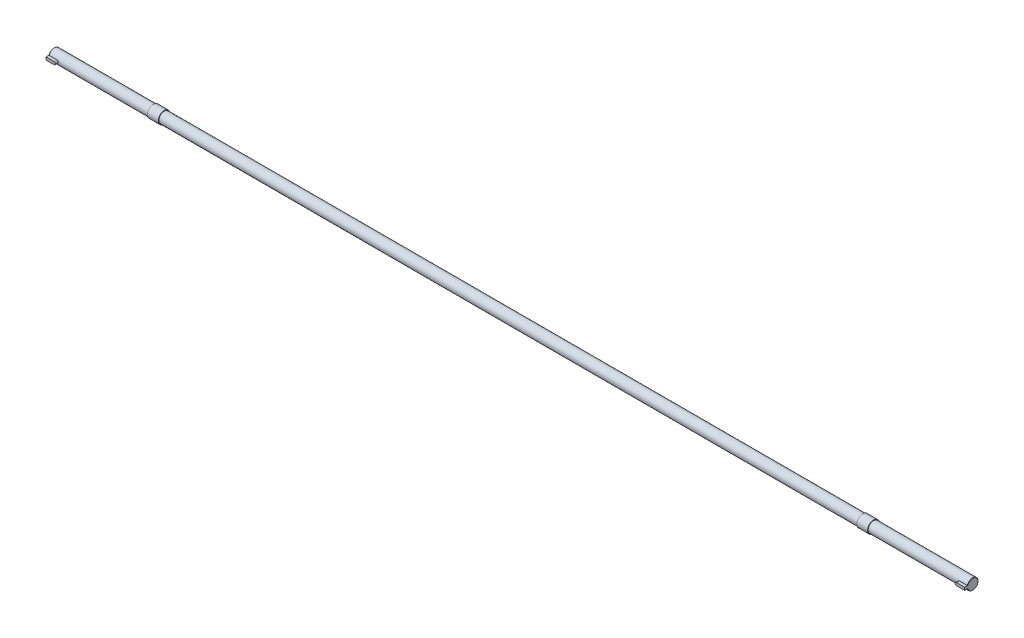
ISO-10303-21;
HEADER;
FILE_DESCRIPTION(('STEP AP214'),'2;1');
FILE_NAME('part.step','',(''),(''),'','','');
FILE_SCHEMA(('AUTOMOTIVE_DESIGN { 1 0 10303 214 1 1 1 1 }'));
ENDSEC;
DATA;
#1=APPLICATION_CONTEXT('core data for automotive mechanical design processes');
#2=APPLICATION_PROTOCOL_DEFINITION('international standard','automotive_design',2000,#1);
#3=PRODUCT_CONTEXT('',#1,'mechanical');
#4=PRODUCT('Part','Part','',(#3));
#5=PRODUCT_RELATED_PRODUCT_CATEGORY('part','',(#4));
#6=PRODUCT_DEFINITION_FORMATION('','',#4);
#7=PRODUCT_DEFINITION_CONTEXT('part definition',#1,'design');
#8=PRODUCT_DEFINITION('design','',#6,#7);
#9=PRODUCT_DEFINITION_SHAPE('','',#8);
#10=(LENGTH_UNIT() NAMED_UNIT(*) SI_UNIT(.MILLI.,.METRE.));
#11=(NAMED_UNIT(*) PLANE_ANGLE_UNIT() SI_UNIT($,.RADIAN.));
#12=(NAMED_UNIT(*) SI_UNIT($,.STERADIAN.) SOLID_ANGLE_UNIT());
#13=UNCERTAINTY_MEASURE_WITH_UNIT(LENGTH_MEASURE(1.E-05),#10,'distance_accuracy_value','');
#14=(GEOMETRIC_REPRESENTATION_CONTEXT(3) GLOBAL_UNCERTAINTY_ASSIGNED_CONTEXT((#13)) GLOBAL_UNIT_ASSIGNED_CONTEXT((#10,
#11,#12)) REPRESENTATION_CONTEXT('',''));
#15=CARTESIAN_POINT('',(0.,0.,0.));
#16=DIRECTION('',(0.,0.,1.));
#17=DIRECTION('',(1.,0.,0.));
#18=AXIS2_PLACEMENT_3D('',#15,#16,#17);
#19=CARTESIAN_POINT('',(-1695.,-20.0000000000002,0.));
#20=DIRECTION('',(-1.,0.,0.));
#21=DIRECTION('',(0.,-1.,0.));
#22=AXIS2_PLACEMENT_3D('',#19,#20,#21);
#23=PLANE('',#22);
#24=CARTESIAN_POINT('',(-1695.,0.,0.));
#25=DIRECTION('',(-1.,0.,0.));
#26=DIRECTION('',(0.,-1.,0.));
#27=AXIS2_PLACEMENT_3D('',#24,#25,#26);
#28=CIRCLE('',#27,19.000000000001);
#29=CARTESIAN_POINT('',(-1695.,5.00000000000015,18.3303027798244));
#30=VERTEX_POINT('',#29);
#31=CARTESIAN_POINT('',(-1695.,-4.99999999999985,18.3303027798245));
#32=VERTEX_POINT('',#31);
#33=EDGE_CURVE('E205',#30,#32,#28,.T.);
#34=ORIENTED_EDGE('',*,*,#33,.T.);
#35=DIRECTION('',(0.,0.,1.));
#36=VECTOR('',#35,1.);
#37=CARTESIAN_POINT('',(-1695.,-4.99999999999985,15.));
#38=LINE('',#37,#36);
#39=CARTESIAN_POINT('',(-1695.,-4.99999999999985,30.));
#40=VERTEX_POINT('',#39);
#41=EDGE_CURVE('E149',#32,#40,#38,.T.);
#42=ORIENTED_EDGE('',*,*,#41,.T.);
#43=DIRECTION('',(0.,-1.,0.));
#44=VECTOR('',#43,1.);
#45=CARTESIAN_POINT('',(-1695.,5.00000000000015,30.));
#46=LINE('',#45,#44);
#47=CARTESIAN_POINT('',(-1695.,5.00000000000015,30.));
#48=VERTEX_POINT('',#47);
#49=EDGE_CURVE('E138',#48,#40,#46,.T.);
#50=ORIENTED_EDGE('',*,*,#49,.F.);
#51=DIRECTION('',(0.,0.,1.));
#52=VECTOR('',#51,1.);
#53=CARTESIAN_POINT('',(-1695.,5.00000000000015,15.));
#54=LINE('',#53,#52);
#55=EDGE_CURVE('E127',#30,#48,#54,.T.);
#56=ORIENTED_EDGE('',*,*,#55,.F.);
#57=EDGE_LOOP('',(#34,#42,#50,#56));
#58=FACE_BOUND('',#57,.T.);
#59=ADVANCED_FACE('F39',(#58),#23,.T.);
#60=CARTESIAN_POINT('',(1695.,0.,0.));
#61=DIRECTION('',(1.,0.,0.));
#62=DIRECTION('',(0.,1.,0.));
#63=AXIS2_PLACEMENT_3D('',#60,#61,#62);
#64=PLANE('',#63);
#65=CARTESIAN_POINT('',(1695.,0.,0.));
#66=DIRECTION('',(1.,0.,0.));
#67=DIRECTION('',(0.,1.,0.));
#68=AXIS2_PLACEMENT_3D('',#65,#66,#67);
#69=CIRCLE('',#68,18.9999999999988);
#70=CARTESIAN_POINT('',(1695.,-5.00000000000007,18.3303027798221));
#71=VERTEX_POINT('',#70);
#72=CARTESIAN_POINT('',(1695.,4.99999999999993,18.3303027798221));
#73=VERTEX_POINT('',#72);
#74=EDGE_CURVE('E213',#71,#73,#69,.T.);
#75=ORIENTED_EDGE('',*,*,#74,.T.);
#76=DIRECTION('',(0.,0.,1.));
#77=VECTOR('',#76,1.);
#78=CARTESIAN_POINT('',(1695.,4.99999999999993,15.));
#79=LINE('',#78,#77);
#80=CARTESIAN_POINT('',(1695.,4.99999999999993,30.));
#81=VERTEX_POINT('',#80);
#82=EDGE_CURVE('E171',#73,#81,#79,.T.);
#83=ORIENTED_EDGE('',*,*,#82,.T.);
#84=DIRECTION('',(0.,1.,0.));
#85=VECTOR('',#84,1.);
#86=CARTESIAN_POINT('',(1695.,4.99999999999993,30.));
#87=LINE('',#86,#85);
#88=CARTESIAN_POINT('',(1695.,-5.00000000000007,30.));
#89=VERTEX_POINT('',#88);
#90=EDGE_CURVE('E161',#89,#81,#87,.T.);
#91=ORIENTED_EDGE('',*,*,#90,.F.);
#92=DIRECTION('',(0.,0.,1.));
#93=VECTOR('',#92,1.);
#94=CARTESIAN_POINT('',(1695.,-5.00000000000007,15.));
#95=LINE('',#94,#93);
#96=EDGE_CURVE('E173',#71,#89,#95,.T.);
#97=ORIENTED_EDGE('',*,*,#96,.F.);
#98=EDGE_LOOP('',(#75,#83,#91,#97));
#99=FACE_BOUND('',#98,.T.);
#100=ADVANCED_FACE('F266',(#99),#64,.T.);
#101=CARTESIAN_POINT('',(-1695.,0.,0.));
#102=DIRECTION('',(-1.,0.,0.));
#103=DIRECTION('',(0.,-1.,0.));
#104=AXIS2_PLACEMENT_3D('',#101,#102,#103);
#105=CYLINDRICAL_SURFACE('',#104,19.9999999999999);
#106=DIRECTION('',(-1.,0.,0.));
#107=VECTOR('',#106,1.);
#108=CARTESIAN_POINT('',(-1695.,4.99999999999983,19.3649167310371));
#109=LINE('',#108,#107);
#110=CARTESIAN_POINT('',(1694.,4.99999999999993,19.364916731037));
#111=VERTEX_POINT('',#110);
#112=CARTESIAN_POINT('',(1665.,4.99999999999993,19.364916731037));
#113=VERTEX_POINT('',#112);
#114=EDGE_CURVE('E178',#111,#113,#109,.T.);
#115=ORIENTED_EDGE('',*,*,#114,.F.);
#116=CARTESIAN_POINT('',(1694.,0.,0.));
#117=DIRECTION('',(1.,0.,0.));
#118=DIRECTION('',(0.,1.,0.));
#119=AXIS2_PLACEMENT_3D('',#116,#117,#118);
#120=CIRCLE('',#119,19.9999999999999);
#121=CARTESIAN_POINT('',(1694.,-5.00000000000007,19.364916731037));
#122=VERTEX_POINT('',#121);
#123=EDGE_CURVE('E210',#111,#122,#120,.F.);
#124=ORIENTED_EDGE('',*,*,#123,.T.);
#125=DIRECTION('',(-1.,0.,0.));
#126=VECTOR('',#125,1.);
#127=CARTESIAN_POINT('',(-1695.,-5.00000000000007,19.364916731037));
#128=LINE('',#127,#126);
#129=CARTESIAN_POINT('',(1665.,-5.00000000000007,19.364916731037));
#130=VERTEX_POINT('',#129);
#131=EDGE_CURVE('E170',#130,#122,#128,.F.);
#132=ORIENTED_EDGE('',*,*,#131,.F.);
#133=CARTESIAN_POINT('',(1670.,0.,19.9999999999999));
#134=CARTESIAN_POINT('',(1669.99999224754,0.276253628899032,19.9999953289337));
#135=CARTESIAN_POINT('',(1669.97702816409,0.552593859435811,19.9942192710608));
#136=CARTESIAN_POINT('',(1669.88591616231,1.09735441256838,19.9717371276631));
#137=CARTESIAN_POINT('',(1669.81774263487,1.36577015623574,19.9550248473325));
#138=CARTESIAN_POINT('',(1669.63853582179,1.8867362406085,19.9125208777343));
#139=CARTESIAN_POINT('',(1669.52755400428,2.13930521143322,19.8867400947352));
#140=CARTESIAN_POINT('',(1669.26606203318,2.62224043968129,19.8288447935873));
#141=CARTESIAN_POINT('',(1669.11555054627,2.85260594782909,19.7967300618052));
#142=CARTESIAN_POINT('',(1668.77599736782,3.28933975766965,19.7289137863897));
#143=CARTESIAN_POINT('',(1668.58629475014,3.49518563353681,19.6931569049375));
#144=CARTESIAN_POINT('',(1668.17515931697,3.872496424011,19.6224540039311));
#145=CARTESIAN_POINT('',(1667.95372292351,4.04395745649721,19.5875080763289));
#146=CARTESIAN_POINT('',(1667.48134924421,4.3500884759965,19.5218258566056));
#147=CARTESIAN_POINT('',(1667.23002256397,4.48417405308376,19.4911598154936));
#148=CARTESIAN_POINT('',(1666.70750529447,4.7079896951691,19.4383164939338));
#149=CARTESIAN_POINT('',(1666.43631788889,4.79772685146706,19.4161378564806));
#150=CARTESIAN_POINT('',(1665.88752167266,4.92851612268247,19.3833492232107));
#151=CARTESIAN_POINT('',(1665.61015034654,4.97050756110678,19.372516366567));
#152=CARTESIAN_POINT('',(1665.05210477,5.00753925022129,19.362978748653));
#153=CARTESIAN_POINT('',(1664.77143106436,5.00258713939363,19.3642720142642));
#154=CARTESIAN_POINT('',(1664.22194730752,4.94662174879894,19.3786401838938));
#155=CARTESIAN_POINT('',(1663.95301459512,4.89672780063535,19.3914287669097));
#156=CARTESIAN_POINT('',(1663.42746316363,4.75408062300985,19.4268903223689));
#157=CARTESIAN_POINT('',(1663.17084532324,4.6613243402312,19.4495639989746));
#158=CARTESIAN_POINT('',(1662.67420661249,4.43463159312386,19.5025037968552));
#159=CARTESIAN_POINT('',(1662.43437942737,4.3002888907763,19.5328442489938));
#160=CARTESIAN_POINT('',(1661.98027096748,3.99452092004976,19.5976570281996));
#161=CARTESIAN_POINT('',(1661.76599417311,3.8230891626961,19.6321300778209));
#162=CARTESIAN_POINT('',(1661.36265461435,3.44221141560405,19.7025293513296));
#163=CARTESIAN_POINT('',(1661.17448503313,3.2318208605528,19.7384689826));
#164=CARTESIAN_POINT('',(1660.83592919179,2.78203972501217,19.8068655192918));
#165=CARTESIAN_POINT('',(1660.68554408579,2.54264825902628,19.8393223183135));
#166=CARTESIAN_POINT('',(1660.42649804592,2.04038629560445,19.897257736473));
#167=CARTESIAN_POINT('',(1660.31798219915,1.77743797736192,19.9227120042575));
#168=CARTESIAN_POINT('',(1660.1469423143,1.23625336047618,19.9635972330471));
#169=CARTESIAN_POINT('',(1660.08440947861,0.958019997168211,19.9790301113093));
#170=CARTESIAN_POINT('',(1660.00847478147,0.401799901300042,19.9978499757124));
#171=CARTESIAN_POINT('',(1659.99385657975,0.123989066627318,20.0015351169425));
#172=CARTESIAN_POINT('',(1660.01083000685,-0.430109582671746,19.997293493815));
#173=CARTESIAN_POINT('',(1660.042417476,-0.706397532148706,19.9893677747284));
#174=CARTESIAN_POINT('',(1660.14990302797,-1.24538089592169,19.9629860375783));
#175=CARTESIAN_POINT('',(1660.22513754492,-1.50821706322923,19.9446878061928));
#176=CARTESIAN_POINT('',(1660.41702361343,-2.0175243081751,19.8996235544719));
#177=CARTESIAN_POINT('',(1660.53367934771,-2.26399373010887,19.8728566789994));
#178=CARTESIAN_POINT('',(1660.80745376292,-2.73841044809942,19.8131102642072));
#179=CARTESIAN_POINT('',(1660.96525370799,-2.96595147278585,19.7800289122193));
#180=CARTESIAN_POINT('',(1661.31596636266,-3.39175537881102,19.7114836395923));
#181=CARTESIAN_POINT('',(1661.50888513206,-3.59001319657752,19.6760193084339));
#182=CARTESIAN_POINT('',(1661.93000653615,-3.95663522690833,19.6056318986474));
#183=CARTESIAN_POINT('',(1662.15895901,-4.12414622540371,19.5707434727399));
#184=CARTESIAN_POINT('',(1662.6424421149,-4.41836919671224,19.5064292794106));
#185=CARTESIAN_POINT('',(1662.8969716099,-4.5450829805383,19.4770032695335));
#186=CARTESIAN_POINT('',(1663.42301907469,-4.75317140202432,19.4272698238586));
#187=CARTESIAN_POINT('',(1663.69442542771,-4.83481465547794,19.4069085073874));
#188=CARTESIAN_POINT('',(1664.24769879285,-4.95115219981067,19.3775581342602));
#189=CARTESIAN_POINT('',(1664.5295635034,-4.98585675825603,19.3685665905606));
#190=CARTESIAN_POINT('',(1665.08707007956,-5.00679530111935,19.363163373566));
#191=CARTESIAN_POINT('',(1665.36265811715,-4.99439299259123,19.3663977560449));
#192=CARTESIAN_POINT('',(1665.90767962894,-4.92459092769661,19.3842636317313));
#193=CARTESIAN_POINT('',(1666.17711322672,-4.86719207562115,19.3988948958967));
#194=CARTESIAN_POINT('',(1666.70069486353,-4.70977106481412,19.4377086899187));
#195=CARTESIAN_POINT('',(1666.9549243508,-4.61000468226928,19.4618338413429));
#196=CARTESIAN_POINT('',(1667.44321794238,-4.37088304534909,19.5169251906948));
#197=CARTESIAN_POINT('',(1667.67727924396,-4.23152230011375,19.547892337323));
#198=CARTESIAN_POINT('',(1668.12518209667,-3.91289249545758,19.6141878088206));
#199=CARTESIAN_POINT('',(1668.33833691141,-3.73267720970769,19.649608827735));
#200=CARTESIAN_POINT('',(1668.73182348265,-3.33929790396572,19.7202675748662));
#201=CARTESIAN_POINT('',(1668.91214743371,-3.12612607087049,19.7555052575659));
#202=CARTESIAN_POINT('',(1669.23803769522,-2.66822528900869,19.8225885215914));
#203=CARTESIAN_POINT('',(1669.38291537891,-2.42299474105467,19.8543611121962));
#204=CARTESIAN_POINT('',(1669.6291582098,-1.91088686503496,19.9101641658365));
#205=CARTESIAN_POINT('',(1669.7305545355,-1.64402521145583,19.9342001733258));
#206=CARTESIAN_POINT('',(1669.8719061011,-1.14803417747826,19.9682686521848));
#207=CARTESIAN_POINT('',(1669.91983747684,-0.921267236360248,19.980086168423));
#208=CARTESIAN_POINT('',(1669.98388647874,-0.463020238454313,19.9959535077315));
#209=CARTESIAN_POINT('',(1670.00000649768,-0.231540537475443,20.0000039150297));
#210=CARTESIAN_POINT('',(1670.,0.,19.9999999999999));
#211=B_SPLINE_CURVE_WITH_KNOTS('',3,(#133,#134,#135,#136,#137,#138,#139,#140,#141,#142,#143,
#144,#145,#146,#147,#148,#149,#150,#151,#152,#153,#154,#155,#156,#157,#158,#159,#160,#161,#162,
#163,#164,#165,#166,#167,#168,#169,#170,#171,#172,#173,#174,#175,#176,#177,#178,#179,#180,#181,
#182,#183,#184,#185,#186,#187,#188,#189,#190,#191,#192,#193,#194,#195,#196,#197,#198,#199,#200,
#201,#202,#203,#204,#205,#206,#207,#208,#209,#210),.UNSPECIFIED.,.T.,.F.,(4,2,2,2,2,2,2,2,2,2,2,
2,2,2,2,2,2,2,2,2,2,2,2,2,2,2,2,2,2,2,2,2,2,2,2,2,2,2,4),(0.,0.827912374906294,1.65629412587965,
2.48368300762034,3.31109980056432,4.15381451457132,4.99662431933545,5.85195491819366,
6.70714870564556,7.54520983670242,8.38313460386727,9.20074990034494,10.0184234489788,
10.8443509292401,11.6704230279827,12.5200500324115,13.3697029853857,14.2222743004146,
15.0746824563988,15.9052769650866,16.7357967038688,17.5540091505786,18.3723042441871,
19.2051195856223,20.0380787670447,20.8914836402599,21.7448506250943,22.5930751539527,
23.4411141086095,24.2647926801853,25.0884546987995,25.9072133522465,26.7260856048284,
27.5663192139288,28.4067523259457,29.2624061835847,30.1174454609768,30.8114080983367,
31.505318535033),.UNSPECIFIED.);
#212=EDGE_CURVE('E247',#113,#130,#211,.T.);
#213=ORIENTED_EDGE('',*,*,#212,.F.);
#214=EDGE_LOOP('',(#115,#124,#132,#213));
#215=FACE_BOUND('',#214,.T.);
#216=CARTESIAN_POINT('',(1328.75,0.,0.));
#217=DIRECTION('',(-1.,0.,0.));
#218=DIRECTION('',(0.,-1.,0.));
#219=AXIS2_PLACEMENT_3D('',#216,#217,#218);
#220=CIRCLE('',#219,20.);
#221=CARTESIAN_POINT('',(1328.75,-20.,0.));
#222=VERTEX_POINT('',#221);
#223=EDGE_CURVE('E202',#222,#222,#220,.T.);
#224=ORIENTED_EDGE('',*,*,#223,.F.);
#225=EDGE_LOOP('',(#224));
#226=FACE_BOUND('',#225,.T.);
#227=ADVANCED_FACE('F260',(#215,#226),#105,.T.);
#228=CARTESIAN_POINT('',(1328.75,-20.,0.));
#229=DIRECTION('',(1.,0.,0.));
#230=DIRECTION('',(0.,1.,0.));
#231=AXIS2_PLACEMENT_3D('',#228,#229,#230);
#232=PLANE('',#231);
#233=ORIENTED_EDGE('',*,*,#223,.T.);
#234=EDGE_LOOP('',(#233));
#235=FACE_BOUND('',#234,.T.);
#236=CARTESIAN_POINT('',(1328.75,0.,0.));
#237=DIRECTION('',(-1.,0.,0.));
#238=DIRECTION('',(0.,-1.,0.));
#239=AXIS2_PLACEMENT_3D('',#236,#237,#238);
#240=CIRCLE('',#239,22.);
#241=CARTESIAN_POINT('',(1328.75,-22.,0.));
#242=VERTEX_POINT('',#241);
#243=EDGE_CURVE('E199',#242,#242,#240,.T.);
#244=ORIENTED_EDGE('',*,*,#243,.F.);
#245=EDGE_LOOP('',(#244));
#246=FACE_BOUND('',#245,.T.);
#247=ADVANCED_FACE('F265',(#235,#246),#232,.T.);
#248=CARTESIAN_POINT('',(-1695.,0.,0.));
#249=DIRECTION('',(-1.,0.,0.));
#250=DIRECTION('',(0.,-1.,0.));
#251=AXIS2_PLACEMENT_3D('',#248,#249,#250);
#252=CYLINDRICAL_SURFACE('',#251,22.);
#253=ORIENTED_EDGE('',*,*,#243,.T.);
#254=EDGE_LOOP('',(#253));
#255=FACE_BOUND('',#254,.T.);
#256=CARTESIAN_POINT('',(1288.75,0.,0.));
#257=DIRECTION('',(-1.,0.,0.));
#258=DIRECTION('',(0.,-1.,0.));
#259=AXIS2_PLACEMENT_3D('',#256,#257,#258);
#260=CIRCLE('',#259,22.);
#261=CARTESIAN_POINT('',(1288.75,-22.,0.));
#262=VERTEX_POINT('',#261);
#263=EDGE_CURVE('E196',#262,#262,#260,.T.);
#264=ORIENTED_EDGE('',*,*,#263,.F.);
#265=EDGE_LOOP('',(#264));
#266=FACE_BOUND('',#265,.T.);
#267=ADVANCED_FACE('F441',(#255,#266),#252,.T.);
#268=CARTESIAN_POINT('',(1288.75,-22.,0.));
#269=DIRECTION('',(-1.,0.,0.));
#270=DIRECTION('',(0.,-1.,0.));
#271=AXIS2_PLACEMENT_3D('',#268,#269,#270);
#272=PLANE('',#271);
#273=ORIENTED_EDGE('',*,*,#263,.T.);
#274=EDGE_LOOP('',(#273));
#275=FACE_BOUND('',#274,.T.);
#276=CARTESIAN_POINT('',(1288.75,0.,0.));
#277=DIRECTION('',(-1.,0.,0.));
#278=DIRECTION('',(0.,-1.,0.));
#279=AXIS2_PLACEMENT_3D('',#276,#277,#278);
#280=CIRCLE('',#279,20.);
#281=CARTESIAN_POINT('',(1288.75,-20.,0.));
#282=VERTEX_POINT('',#281);
#283=EDGE_CURVE('E193',#282,#282,#280,.T.);
#284=ORIENTED_EDGE('',*,*,#283,.F.);
#285=EDGE_LOOP('',(#284));
#286=FACE_BOUND('',#285,.T.);
#287=ADVANCED_FACE('F432',(#275,#286),#272,.T.);
#288=CARTESIAN_POINT('',(-1695.,0.,0.));
#289=DIRECTION('',(-1.,0.,0.));
#290=DIRECTION('',(0.,-1.,0.));
#291=AXIS2_PLACEMENT_3D('',#288,#289,#290);
#292=CYLINDRICAL_SURFACE('',#291,20.0000000000002);
#293=ORIENTED_EDGE('',*,*,#283,.T.);
#294=EDGE_LOOP('',(#293));
#295=FACE_BOUND('',#294,.T.);
#296=CARTESIAN_POINT('',(-1288.75,0.,0.));
#297=DIRECTION('',(-1.,0.,0.));
#298=DIRECTION('',(0.,-1.,0.));
#299=AXIS2_PLACEMENT_3D('',#296,#297,#298);
#300=CIRCLE('',#299,20.0000000000003);
#301=CARTESIAN_POINT('',(-1288.75,-20.0000000000003,0.));
#302=VERTEX_POINT('',#301);
#303=EDGE_CURVE('E190',#302,#302,#300,.T.);
#304=ORIENTED_EDGE('',*,*,#303,.F.);
#305=EDGE_LOOP('',(#304));
#306=FACE_BOUND('',#305,.T.);
#307=ADVANCED_FACE('F423',(#295,#306),#292,.T.);
#308=CARTESIAN_POINT('',(-1288.75,-20.0000000000003,0.));
#309=DIRECTION('',(1.,0.,0.));
#310=DIRECTION('',(0.,1.,0.));
#311=AXIS2_PLACEMENT_3D('',#308,#309,#310);
#312=PLANE('',#311);
#313=ORIENTED_EDGE('',*,*,#303,.T.);
#314=EDGE_LOOP('',(#313));
#315=FACE_BOUND('',#314,.T.);
#316=CARTESIAN_POINT('',(-1288.75,0.,0.));
#317=DIRECTION('',(-1.,0.,0.));
#318=DIRECTION('',(0.,-1.,0.));
#319=AXIS2_PLACEMENT_3D('',#316,#317,#318);
#320=CIRCLE('',#319,22.0000000000001);
#321=CARTESIAN_POINT('',(-1288.75,-22.0000000000001,0.));
#322=VERTEX_POINT('',#321);
#323=EDGE_CURVE('E187',#322,#322,#320,.T.);
#324=ORIENTED_EDGE('',*,*,#323,.F.);
#325=EDGE_LOOP('',(#324));
#326=FACE_BOUND('',#325,.T.);
#327=ADVANCED_FACE('F414',(#315,#326),#312,.T.);
#328=CARTESIAN_POINT('',(-1695.,0.,0.));
#329=DIRECTION('',(-1.,0.,0.));
#330=DIRECTION('',(0.,-1.,0.));
#331=AXIS2_PLACEMENT_3D('',#328,#329,#330);
#332=CYLINDRICAL_SURFACE('',#331,22.0000000000002);
#333=ORIENTED_EDGE('',*,*,#323,.T.);
#334=EDGE_LOOP('',(#333));
#335=FACE_BOUND('',#334,.T.);
#336=CARTESIAN_POINT('',(-1328.75,0.,0.));
#337=DIRECTION('',(-1.,0.,0.));
#338=DIRECTION('',(0.,-1.,0.));
#339=AXIS2_PLACEMENT_3D('',#336,#337,#338);
#340=CIRCLE('',#339,22.0000000000002);
#341=CARTESIAN_POINT('',(-1328.75,-22.0000000000002,0.));
#342=VERTEX_POINT('',#341);
#343=EDGE_CURVE('E184',#342,#342,#340,.T.);
#344=ORIENTED_EDGE('',*,*,#343,.F.);
#345=EDGE_LOOP('',(#344));
#346=FACE_BOUND('',#345,.T.);
#347=ADVANCED_FACE('F406',(#335,#346),#332,.T.);
#348=CARTESIAN_POINT('',(-1328.75,-22.0000000000002,0.));
#349=DIRECTION('',(-1.,0.,0.));
#350=DIRECTION('',(0.,-1.,0.));
#351=AXIS2_PLACEMENT_3D('',#348,#349,#350);
#352=PLANE('',#351);
#353=ORIENTED_EDGE('',*,*,#343,.T.);
#354=EDGE_LOOP('',(#353));
#355=FACE_BOUND('',#354,.T.);
#356=CARTESIAN_POINT('',(-1328.75,0.,0.));
#357=DIRECTION('',(-1.,0.,0.));
#358=DIRECTION('',(0.,-1.,0.));
#359=AXIS2_PLACEMENT_3D('',#356,#357,#358);
#360=CIRCLE('',#359,20.0000000000001);
#361=CARTESIAN_POINT('',(-1328.75,-20.0000000000001,0.));
#362=VERTEX_POINT('',#361);
#363=EDGE_CURVE('E181',#362,#362,#360,.T.);
#364=ORIENTED_EDGE('',*,*,#363,.F.);
#365=EDGE_LOOP('',(#364));
#366=FACE_BOUND('',#365,.T.);
#367=ADVANCED_FACE('F400',(#355,#366),#352,.T.);
#368=CARTESIAN_POINT('',(-1695.,0.,0.));
#369=DIRECTION('',(-1.,0.,0.));
#370=DIRECTION('',(0.,-1.,0.));
#371=AXIS2_PLACEMENT_3D('',#368,#369,#370);
#372=CYLINDRICAL_SURFACE('',#371,20.0000000000002);
#373=DIRECTION('',(-1.,0.,0.));
#374=VECTOR('',#373,1.);
#375=CARTESIAN_POINT('',(-1695.,-4.99999999999985,19.3649167310373));
#376=LINE('',#375,#374);
#377=CARTESIAN_POINT('',(-1694.,-4.99999999999985,19.3649167310373));
#378=VERTEX_POINT('',#377);
#379=CARTESIAN_POINT('',(-1665.,-4.99999999999985,19.3649167310373));
#380=VERTEX_POINT('',#379);
#381=EDGE_CURVE('E153',#378,#380,#376,.F.);
#382=ORIENTED_EDGE('',*,*,#381,.F.);
#383=CARTESIAN_POINT('',(-1694.,0.,0.));
#384=DIRECTION('',(-1.,0.,0.));
#385=DIRECTION('',(0.,-1.,0.));
#386=AXIS2_PLACEMENT_3D('',#383,#384,#385);
#387=CIRCLE('',#386,20.0000000000002);
#388=CARTESIAN_POINT('',(-1694.,5.00000000000015,19.3649167310372));
#389=VERTEX_POINT('',#388);
#390=EDGE_CURVE('E208',#378,#389,#387,.F.);
#391=ORIENTED_EDGE('',*,*,#390,.T.);
#392=DIRECTION('',(-1.,0.,0.));
#393=VECTOR('',#392,1.);
#394=CARTESIAN_POINT('',(-1695.,5.00000000000015,19.3649167310372));
#395=LINE('',#394,#393);
#396=CARTESIAN_POINT('',(-1665.,5.00000000000015,19.3649167310372));
#397=VERTEX_POINT('',#396);
#398=EDGE_CURVE('E64',#397,#389,#395,.T.);
#399=ORIENTED_EDGE('',*,*,#398,.F.);
#400=CARTESIAN_POINT('',(-1660.,1.49186218934005E-13,20.0000000000002));
#401=CARTESIAN_POINT('',(-1660.00000775246,0.276253628899255,19.9999953289339));
#402=CARTESIAN_POINT('',(-1660.02297183591,0.552593859436034,19.994219271061));
#403=CARTESIAN_POINT('',(-1660.11408383769,1.09735441256861,19.9717371276633));
#404=CARTESIAN_POINT('',(-1660.18225736513,1.36577015623596,19.9550248473327));
#405=CARTESIAN_POINT('',(-1660.36146417821,1.88673624060872,19.9125208777346));
#406=CARTESIAN_POINT('',(-1660.47244599572,2.13930521143344,19.8867400947354));
#407=CARTESIAN_POINT('',(-1660.73393796682,2.62224043968151,19.8288447935875));
#408=CARTESIAN_POINT('',(-1660.88444945373,2.85260594782932,19.7967300618054));
#409=CARTESIAN_POINT('',(-1661.22400263218,3.28933975766979,19.7289137863899));
#410=CARTESIAN_POINT('',(-1661.41370524986,3.49518563353687,19.6931569049377));
#411=CARTESIAN_POINT('',(-1661.82484068303,3.87249642401109,19.6224540039314));
#412=CARTESIAN_POINT('',(-1662.04627707649,4.04395745649738,19.5875080763291));
#413=CARTESIAN_POINT('',(-1662.51865075579,4.35008847599673,19.5218258566057));
#414=CARTESIAN_POINT('',(-1662.76997743603,4.48417405308398,19.4911598154938));
#415=CARTESIAN_POINT('',(-1663.29249470553,4.70798969516933,19.438316493934));
#416=CARTESIAN_POINT('',(-1663.56368211111,4.79772685146728,19.4161378564807));
#417=CARTESIAN_POINT('',(-1664.11247832734,4.92851612268268,19.3833492232109));
#418=CARTESIAN_POINT('',(-1664.38984965346,4.97050756110698,19.3725163665672));
#419=CARTESIAN_POINT('',(-1664.94789523,5.00753925022152,19.3629787486532));
#420=CARTESIAN_POINT('',(-1665.22856893564,5.00258713939386,19.3642720142644));
#421=CARTESIAN_POINT('',(-1665.77805269248,4.94662174879916,19.378640183894));
#422=CARTESIAN_POINT('',(-1666.04698540488,4.89672780063557,19.3914287669099));
#423=CARTESIAN_POINT('',(-1666.57253683637,4.75408062301008,19.4268903223691));
#424=CARTESIAN_POINT('',(-1666.82915467676,4.66132434023143,19.4495639989748));
#425=CARTESIAN_POINT('',(-1667.32579338751,4.4346315931241,19.5025037968554));
#426=CARTESIAN_POINT('',(-1667.56562057263,4.30028889077657,19.532844248994));
#427=CARTESIAN_POINT('',(-1668.01972903252,3.99452092005005,19.5976570281998));
#428=CARTESIAN_POINT('',(-1668.23400582689,3.82308916269637,19.632130077821));
#429=CARTESIAN_POINT('',(-1668.63734538565,3.44221141560434,19.7025293513298));
#430=CARTESIAN_POINT('',(-1668.82551496687,3.23182086055315,19.7384689826001));
#431=CARTESIAN_POINT('',(-1669.16407080821,2.78203972501253,19.806865519292));
#432=CARTESIAN_POINT('',(-1669.31445591421,2.54264825902658,19.8393223183137));
#433=CARTESIAN_POINT('',(-1669.57350195408,2.0403862956047,19.8972577364732));
#434=CARTESIAN_POINT('',(-1669.68201780085,1.77743797736219,19.9227120042577));
#435=CARTESIAN_POINT('',(-1669.8530576857,1.23625336047645,19.9635972330474));
#436=CARTESIAN_POINT('',(-1669.91559052139,0.958019997168452,19.9790301113095));
#437=CARTESIAN_POINT('',(-1669.99152521853,0.401799901300258,19.9978499757126));
#438=CARTESIAN_POINT('',(-1670.00614342025,0.123989066627533,20.0015351169427));
#439=CARTESIAN_POINT('',(-1669.98916999315,-0.430109582671532,19.9972934938152));
#440=CARTESIAN_POINT('',(-1669.957582524,-0.706397532148493,19.9893677747286));
#441=CARTESIAN_POINT('',(-1669.85009697203,-1.24538089592148,19.9629860375785));
#442=CARTESIAN_POINT('',(-1669.77486245508,-1.50821706322901,19.9446878061931));
#443=CARTESIAN_POINT('',(-1669.58297638657,-2.01752430817489,19.8996235544721));
#444=CARTESIAN_POINT('',(-1669.46632065229,-2.26399373010866,19.8728566789996));
#445=CARTESIAN_POINT('',(-1669.19254623708,-2.7384104480992,19.8131102642074));
#446=CARTESIAN_POINT('',(-1669.03474629201,-2.96595147278563,19.7800289122195));
#447=CARTESIAN_POINT('',(-1668.68403363734,-3.3917553788108,19.7114836395926));
#448=CARTESIAN_POINT('',(-1668.49111486794,-3.5900131965773,19.6760193084342));
#449=CARTESIAN_POINT('',(-1668.06999346385,-3.95663522690811,19.6056318986477));
#450=CARTESIAN_POINT('',(-1667.84104099,-4.12414622540349,19.5707434727401));
#451=CARTESIAN_POINT('',(-1667.35755788511,-4.41836919671202,19.5064292794109));
#452=CARTESIAN_POINT('',(-1667.1030283901,-4.54508298053807,19.4770032695338));
#453=CARTESIAN_POINT('',(-1666.57698092531,-4.7531714020241,19.4272698238589));
#454=CARTESIAN_POINT('',(-1666.30557457229,-4.83481465547771,19.4069085073877));
#455=CARTESIAN_POINT('',(-1665.75230120715,-4.95115219981044,19.3775581342605));
#456=CARTESIAN_POINT('',(-1665.4704364966,-4.98585675825581,19.3685665905609));
#457=CARTESIAN_POINT('',(-1664.91292992044,-5.00679530111913,19.3631633735663));
#458=CARTESIAN_POINT('',(-1664.63734188285,-4.994392992591,19.3663977560452));
#459=CARTESIAN_POINT('',(-1664.09232037106,-4.92459092769639,19.3842636317315));
#460=CARTESIAN_POINT('',(-1663.82288677328,-4.86719207562093,19.398894895897));
#461=CARTESIAN_POINT('',(-1663.29930513647,-4.7097710648139,19.4377086899189));
#462=CARTESIAN_POINT('',(-1663.0450756492,-4.61000468226906,19.4618338413432));
#463=CARTESIAN_POINT('',(-1662.55678205762,-4.37088304534887,19.5169251906951));
#464=CARTESIAN_POINT('',(-1662.32272075604,-4.23152230011353,19.5478923373233));
#465=CARTESIAN_POINT('',(-1661.87481790333,-3.91289249545736,19.6141878088208));
#466=CARTESIAN_POINT('',(-1661.66166308859,-3.73267720970746,19.6496088277353));
#467=CARTESIAN_POINT('',(-1661.26817651735,-3.3392979039655,19.7202675748665));
#468=CARTESIAN_POINT('',(-1661.08785256629,-3.12612607087026,19.7555052575662));
#469=CARTESIAN_POINT('',(-1660.76196230478,-2.66822528900847,19.8225885215917));
#470=CARTESIAN_POINT('',(-1660.61708462109,-2.42299474105445,19.8543611121965));
#471=CARTESIAN_POINT('',(-1660.3708417902,-1.91088686503473,19.9101641658367));
#472=CARTESIAN_POINT('',(-1660.2694454645,-1.6440252114556,19.9342001733261));
#473=CARTESIAN_POINT('',(-1660.1280938989,-1.14803417747805,19.968268652185));
#474=CARTESIAN_POINT('',(-1660.08016252316,-0.921267236360059,19.9800861684232));
#475=CARTESIAN_POINT('',(-1660.01611352126,-0.463020238454128,19.9959535077317));
#476=CARTESIAN_POINT('',(-1659.99999350232,-0.23154053747524,20.00000391503));
#477=CARTESIAN_POINT('',(-1660.,1.49186218934005E-13,20.0000000000002));
#478=B_SPLINE_CURVE_WITH_KNOTS('',3,(#400,#401,#402,#403,#404,#405,#406,#407,#408,#409,#410,
#411,#412,#413,#414,#415,#416,#417,#418,#419,#420,#421,#422,#423,#424,#425,#426,#427,#428,#429,
#430,#431,#432,#433,#434,#435,#436,#437,#438,#439,#440,#441,#442,#443,#444,#445,#446,#447,#448,
#449,#450,#451,#452,#453,#454,#455,#456,#457,#458,#459,#460,#461,#462,#463,#464,#465,#466,#467,
#468,#469,#470,#471,#472,#473,#474,#475,#476,#477),.UNSPECIFIED.,.T.,.F.,(4,2,2,2,2,2,2,2,2,2,2,
2,2,2,2,2,2,2,2,2,2,2,2,2,2,2,2,2,2,2,2,2,2,2,2,2,2,2,4),(0.,0.827912374906296,1.65629412587966,
2.48368300762034,3.31109980056432,4.15381451457101,4.99662431933545,5.85195491819366,
6.70714870564556,7.54520983670221,8.38313460386727,9.20074990034495,10.0184234489788,
10.8443509292398,11.6704230279827,12.5200500324112,13.3697029853857,14.2222743004145,
15.0746824563988,15.9052769650866,16.7357967038688,17.5540091505786,18.3723042441871,
19.2051195856223,20.0380787670447,20.8914836402599,21.7448506250943,22.5930751539527,
23.4411141086095,24.2647926801852,25.0884546987995,25.9072133522465,26.7260856048284,
27.5663192139288,28.4067523259457,29.2624061835847,30.1174454609768,30.8114080983367,
31.505318535033),.UNSPECIFIED.);
#479=EDGE_CURVE('E11',#380,#397,#478,.T.);
#480=ORIENTED_EDGE('',*,*,#479,.F.);
#481=EDGE_LOOP('',(#382,#391,#399,#480));
#482=FACE_BOUND('',#481,.T.);
#483=ORIENTED_EDGE('',*,*,#363,.T.);
#484=EDGE_LOOP('',(#483));
#485=FACE_BOUND('',#484,.T.);
#486=ADVANCED_FACE('F244',(#482,#485),#372,.T.);
#487=CARTESIAN_POINT('',(-1695.,0.,0.));
#488=DIRECTION('',(1.,0.,0.));
#489=DIRECTION('',(0.,1.,0.));
#490=AXIS2_PLACEMENT_3D('',#487,#488,#489);
#491=CONICAL_SURFACE('',#490,19.000000000001,0.785398163397188);
#492=CARTESIAN_POINT('',(-1700.09921951359,-4.99999999999985,12.9704162666964));
#493=CARTESIAN_POINT('',(-1699.86977847328,-4.99999999999985,13.2163079241905));
#494=CARTESIAN_POINT('',(-1699.63989411241,-4.99999999999985,13.4617850469457));
#495=CARTESIAN_POINT('',(-1699.17935337885,-4.99999999999985,13.9520128835975));
#496=CARTESIAN_POINT('',(-1698.94869700827,-4.99999999999985,14.1967635994746));
#497=CARTESIAN_POINT('',(-1698.25574501891,-4.99999999999985,14.9300767640585));
#498=CARTESIAN_POINT('',(-1697.79246147509,-4.99999999999985,15.4177056291328));
#499=CARTESIAN_POINT('',(-1696.86392052576,-4.99999999999985,16.3910488462636));
#500=CARTESIAN_POINT('',(-1696.39866318343,-4.99999999999985,16.8767632586378));
#501=CARTESIAN_POINT('',(-1695.46659900962,-4.99999999999985,17.8467054099486));
#502=CARTESIAN_POINT('',(-1694.99979217318,-4.99999999999985,18.3309331441207));
#503=CARTESIAN_POINT('',(-1693.59758011302,-4.99999999999985,19.7818330868832));
#504=CARTESIAN_POINT('',(-1692.66035767119,-4.99999999999985,20.7467488618879));
#505=CARTESIAN_POINT('',(-1691.25213385202,-4.99999999999985,22.1918190322569));
#506=CARTESIAN_POINT('',(-1690.78232003307,-4.99999999999985,22.6731328396393));
#507=CARTESIAN_POINT('',(-1689.8420223742,-4.99999999999985,23.6351054376196));
#508=CARTESIAN_POINT('',(-1689.37153853439,-4.99999999999985,24.1157642283202));
#509=CARTESIAN_POINT('',(-1688.90078048641,-4.99999999999985,24.5961545813852));
#510=B_SPLINE_CURVE_WITH_KNOTS('',3,(#492,#493,#494,#495,#496,#497,#498,#499,#500,#501,#502,
#503,#504,#505,#506,#507,#508,#509),.UNSPECIFIED.,.F.,.F.,(4,2,2,2,2,2,2,2,4),(0.,1.00893508932,
2.01786742532995,4.03570992400111,6.05348833103043,8.07127319786384,12.1067315504835,
14.1245251573419,16.1423184475065),.UNSPECIFIED.);
#511=EDGE_CURVE('E54',#32,#378,#510,.T.);
#512=ORIENTED_EDGE('',*,*,#511,.F.);
#513=ORIENTED_EDGE('',*,*,#33,.F.);
#514=CARTESIAN_POINT('',(-1688.90078048641,5.00000000000015,24.5961545813851));
#515=CARTESIAN_POINT('',(-1689.37153853439,5.00000000000015,24.1157642283201));
#516=CARTESIAN_POINT('',(-1689.8420223742,5.00000000000015,23.6351054376195));
#517=CARTESIAN_POINT('',(-1690.78232003307,5.00000000000015,22.6731328396393));
#518=CARTESIAN_POINT('',(-1691.25213385202,5.00000000000015,22.1918190322568));
#519=CARTESIAN_POINT('',(-1692.66035767119,5.00000000000015,20.7467488618879));
#520=CARTESIAN_POINT('',(-1693.59758011302,5.00000000000015,19.7818330868832));
#521=CARTESIAN_POINT('',(-1694.99979217318,5.00000000000015,18.3309331441206));
#522=CARTESIAN_POINT('',(-1695.46659900962,5.00000000000015,17.8467054099485));
#523=CARTESIAN_POINT('',(-1696.39866318343,5.00000000000015,16.8767632586377));
#524=CARTESIAN_POINT('',(-1696.86392052576,5.00000000000015,16.3910488462635));
#525=CARTESIAN_POINT('',(-1697.79246147509,5.00000000000015,15.4177056291327));
#526=CARTESIAN_POINT('',(-1698.25574501891,5.00000000000015,14.9300767640584));
#527=CARTESIAN_POINT('',(-1698.94869700827,5.00000000000015,14.1967635994745));
#528=CARTESIAN_POINT('',(-1699.17935337885,5.00000000000015,13.9520128835974));
#529=CARTESIAN_POINT('',(-1699.63989411241,5.00000000000015,13.4617850469456));
#530=CARTESIAN_POINT('',(-1699.86977847328,5.00000000000015,13.2163079241904));
#531=CARTESIAN_POINT('',(-1700.09921951359,5.00000000000015,12.9704162666963));
#532=B_SPLINE_CURVE_WITH_KNOTS('',3,(#514,#515,#516,#517,#518,#519,#520,#521,#522,#523,#524,
#525,#526,#527,#528,#529,#530,#531),.UNSPECIFIED.,.F.,.F.,(4,2,2,2,2,2,2,2,4),(0.,
2.01779329016458,4.03558689702297,8.0710452496426,10.088830116476,12.1066085235053,
14.1244510221765,15.1333833581864,16.1423184475064),.UNSPECIFIED.);
#533=EDGE_CURVE('E254',#389,#30,#532,.T.);
#534=ORIENTED_EDGE('',*,*,#533,.F.);
#535=ORIENTED_EDGE('',*,*,#390,.F.);
#536=EDGE_LOOP('',(#512,#513,#534,#535));
#537=FACE_BOUND('',#536,.T.);
#538=ADVANCED_FACE('F275',(#537),#491,.T.);
#539=CARTESIAN_POINT('',(1694.,0.,0.));
#540=DIRECTION('',(-1.,0.,0.));
#541=DIRECTION('',(0.,-1.,0.));
#542=AXIS2_PLACEMENT_3D('',#539,#540,#541);
#543=CONICAL_SURFACE('',#542,19.9999999999999,0.785398163397625);
#544=CARTESIAN_POINT('',(1700.09921951359,4.99999999999993,12.9704162666892));
#545=CARTESIAN_POINT('',(1699.86977847328,4.99999999999993,13.2163079241836));
#546=CARTESIAN_POINT('',(1699.63989411241,4.99999999999993,13.461785046939));
#547=CARTESIAN_POINT('',(1699.17935337885,4.99999999999993,13.9520128835914));
#548=CARTESIAN_POINT('',(1698.94869700827,4.99999999999993,14.1967635994687));
#549=CARTESIAN_POINT('',(1698.25574501891,4.99999999999993,14.9300767640534));
#550=CARTESIAN_POINT('',(1697.79246147509,4.99999999999993,15.4177056291281));
#551=CARTESIAN_POINT('',(1696.86392052576,4.99999999999993,16.3910488462598));
#552=CARTESIAN_POINT('',(1696.39866318343,4.99999999999993,16.8767632586344));
#553=CARTESIAN_POINT('',(1695.46659900962,4.99999999999993,17.8467054099462));
#554=CARTESIAN_POINT('',(1694.99979217318,4.99999999999993,18.3309331441188));
#555=CARTESIAN_POINT('',(1693.59758011301,4.99999999999993,19.7818330868828));
#556=CARTESIAN_POINT('',(1692.66035767119,4.99999999999993,20.7467488618884));
#557=CARTESIAN_POINT('',(1691.25213385202,4.99999999999993,22.1918190322589));
#558=CARTESIAN_POINT('',(1690.78232003307,4.99999999999993,22.6731328396418));
#559=CARTESIAN_POINT('',(1689.8420223742,4.99999999999993,23.635105437623));
#560=CARTESIAN_POINT('',(1689.37153853439,4.99999999999993,24.1157642283241));
#561=CARTESIAN_POINT('',(1688.90078048641,4.99999999999993,24.5961545813895));
#562=B_SPLINE_CURVE_WITH_KNOTS('',3,(#544,#545,#546,#547,#548,#549,#550,#551,#552,#553,#554,
#555,#556,#557,#558,#559,#560,#561),.UNSPECIFIED.,.F.,.F.,(4,2,2,2,2,2,2,2,4),(0.,
1.00893508932057,2.0178674253313,4.03570992400339,6.0534883310337,8.0712731978683,
12.1067315504904,14.1245251573497,16.1423184475155),.UNSPECIFIED.);
#563=EDGE_CURVE('E224',#73,#111,#562,.T.);
#564=ORIENTED_EDGE('',*,*,#563,.F.);
#565=ORIENTED_EDGE('',*,*,#74,.F.);
#566=CARTESIAN_POINT('',(1688.90078048641,-5.00000000000007,24.5961545813894));
#567=CARTESIAN_POINT('',(1689.37153853439,-5.00000000000007,24.115764228324));
#568=CARTESIAN_POINT('',(1689.8420223742,-5.00000000000007,23.6351054376229));
#569=CARTESIAN_POINT('',(1690.78232003307,-5.00000000000007,22.6731328396417));
#570=CARTESIAN_POINT('',(1691.25213385202,-5.00000000000007,22.1918190322588));
#571=CARTESIAN_POINT('',(1692.66035767119,-5.00000000000007,20.7467488618884));
#572=CARTESIAN_POINT('',(1693.59758011301,-5.00000000000007,19.7818330868827));
#573=CARTESIAN_POINT('',(1694.99979217318,-5.00000000000007,18.3309331441188));
#574=CARTESIAN_POINT('',(1695.46659900962,-5.00000000000007,17.8467054099462));
#575=CARTESIAN_POINT('',(1696.39866318343,-5.00000000000007,16.8767632586345));
#576=CARTESIAN_POINT('',(1696.86392052576,-5.00000000000007,16.3910488462598));
#577=CARTESIAN_POINT('',(1697.79246147509,-5.00000000000007,15.4177056291281));
#578=CARTESIAN_POINT('',(1698.25574501891,-5.00000000000007,14.9300767640534));
#579=CARTESIAN_POINT('',(1698.94869700827,-5.00000000000007,14.1967635994687));
#580=CARTESIAN_POINT('',(1699.17935337885,-5.00000000000007,13.9520128835913));
#581=CARTESIAN_POINT('',(1699.63989411241,-5.00000000000007,13.461785046939));
#582=CARTESIAN_POINT('',(1699.86977847328,-5.00000000000007,13.2163079241835));
#583=CARTESIAN_POINT('',(1700.09921951359,-5.00000000000007,12.9704162666892));
#584=B_SPLINE_CURVE_WITH_KNOTS('',3,(#566,#567,#568,#569,#570,#571,#572,#573,#574,#575,#576,
#577,#578,#579,#580,#581,#582,#583),.UNSPECIFIED.,.F.,.F.,(4,2,2,2,2,2,2,2,4),(0.,
2.01779329016576,4.0355868970251,8.07104524964717,10.0888301164817,12.1066085235121,
14.1244510221842,15.1333833581948,16.1423184475155),.UNSPECIFIED.);
#585=EDGE_CURVE('E216',#122,#71,#584,.T.);
#586=ORIENTED_EDGE('',*,*,#585,.F.);
#587=ORIENTED_EDGE('',*,*,#123,.F.);
#588=EDGE_LOOP('',(#564,#565,#586,#587));
#589=FACE_BOUND('',#588,.T.);
#590=ADVANCED_FACE('F42',(#589),#543,.T.);
#591=CARTESIAN_POINT('',(1665.,0.,15.));
#592=DIRECTION('',(0.,0.,1.));
#593=DIRECTION('',(1.,0.,0.));
#594=AXIS2_PLACEMENT_3D('',#591,#592,#593);
#595=CYLINDRICAL_SURFACE('',#594,5.);
#596=DIRECTION('',(0.,0.,1.));
#597=VECTOR('',#596,1.);
#598=CARTESIAN_POINT('',(1665.,4.99999999999993,15.));
#599=LINE('',#598,#597);
#600=CARTESIAN_POINT('',(1665.,4.99999999999993,30.));
#601=VERTEX_POINT('',#600);
#602=EDGE_CURVE('E168',#113,#601,#599,.T.);
#603=ORIENTED_EDGE('',*,*,#602,.F.);
#604=ORIENTED_EDGE('',*,*,#212,.T.);
#605=DIRECTION('',(0.,0.,1.));
#606=VECTOR('',#605,1.);
#607=CARTESIAN_POINT('',(1665.,-5.00000000000007,15.));
#608=LINE('',#607,#606);
#609=CARTESIAN_POINT('',(1665.,-5.00000000000007,30.));
#610=VERTEX_POINT('',#609);
#611=EDGE_CURVE('E167',#130,#610,#608,.T.);
#612=ORIENTED_EDGE('',*,*,#611,.T.);
#613=CARTESIAN_POINT('',(1665.,0.,30.));
#614=DIRECTION('',(0.,0.,1.));
#615=DIRECTION('',(1.,0.,0.));
#616=AXIS2_PLACEMENT_3D('',#613,#614,#615);
#617=CIRCLE('',#616,5.);
#618=EDGE_CURVE('E155',#601,#610,#617,.T.);
#619=ORIENTED_EDGE('',*,*,#618,.F.);
#620=EDGE_LOOP('',(#603,#604,#612,#619));
#621=FACE_BOUND('',#620,.T.);
#622=ADVANCED_FACE('F240',(#621),#595,.T.);
#623=CARTESIAN_POINT('',(1665.,4.99999999999993,15.));
#624=DIRECTION('',(0.,1.,0.));
#625=DIRECTION('',(-1.,0.,0.));
#626=AXIS2_PLACEMENT_3D('',#623,#624,#625);
#627=PLANE('',#626);
#628=ORIENTED_EDGE('',*,*,#563,.T.);
#629=ORIENTED_EDGE('',*,*,#114,.T.);
#630=ORIENTED_EDGE('',*,*,#602,.T.);
#631=DIRECTION('',(-1.,0.,0.));
#632=VECTOR('',#631,1.);
#633=CARTESIAN_POINT('',(1665.,4.99999999999993,30.));
#634=LINE('',#633,#632);
#635=EDGE_CURVE('E164',#81,#601,#634,.T.);
#636=ORIENTED_EDGE('',*,*,#635,.F.);
#637=ORIENTED_EDGE('',*,*,#82,.F.);
#638=EDGE_LOOP('',(#628,#629,#630,#636,#637));
#639=FACE_BOUND('',#638,.T.);
#640=ADVANCED_FACE('F236',(#639),#627,.T.);
#641=CARTESIAN_POINT('',(1665.,-5.00000000000007,15.));
#642=DIRECTION('',(0.,-1.,0.));
#643=DIRECTION('',(0.,0.,-1.));
#644=AXIS2_PLACEMENT_3D('',#641,#642,#643);
#645=PLANE('',#644);
#646=ORIENTED_EDGE('',*,*,#611,.F.);
#647=ORIENTED_EDGE('',*,*,#131,.T.);
#648=ORIENTED_EDGE('',*,*,#585,.T.);
#649=ORIENTED_EDGE('',*,*,#96,.T.);
#650=DIRECTION('',(1.,0.,0.));
#651=VECTOR('',#650,1.);
#652=CARTESIAN_POINT('',(1665.,-5.00000000000007,30.));
#653=LINE('',#652,#651);
#654=EDGE_CURVE('E158',#610,#89,#653,.T.);
#655=ORIENTED_EDGE('',*,*,#654,.F.);
#656=EDGE_LOOP('',(#646,#647,#648,#649,#655));
#657=FACE_BOUND('',#656,.T.);
#658=ADVANCED_FACE('F231',(#657),#645,.T.);
#659=CARTESIAN_POINT('',(1665.,0.,30.));
#660=DIRECTION('',(0.,0.,1.));
#661=DIRECTION('',(1.,0.,0.));
#662=AXIS2_PLACEMENT_3D('',#659,#660,#661);
#663=PLANE('',#662);
#664=ORIENTED_EDGE('',*,*,#618,.T.);
#665=ORIENTED_EDGE('',*,*,#654,.T.);
#666=ORIENTED_EDGE('',*,*,#90,.T.);
#667=ORIENTED_EDGE('',*,*,#635,.T.);
#668=EDGE_LOOP('',(#664,#665,#666,#667));
#669=FACE_BOUND('',#668,.T.);
#670=ADVANCED_FACE('F235',(#669),#663,.T.);
#671=CARTESIAN_POINT('',(-1665.,1.49186218934005E-13,15.));
#672=DIRECTION('',(0.,0.,1.));
#673=DIRECTION('',(1.,0.,0.));
#674=AXIS2_PLACEMENT_3D('',#671,#672,#673);
#675=CYLINDRICAL_SURFACE('',#674,5.);
#676=DIRECTION('',(0.,0.,1.));
#677=VECTOR('',#676,1.);
#678=CARTESIAN_POINT('',(-1665.,-4.99999999999985,15.));
#679=LINE('',#678,#677);
#680=CARTESIAN_POINT('',(-1665.,-4.99999999999985,30.));
#681=VERTEX_POINT('',#680);
#682=EDGE_CURVE('E147',#380,#681,#679,.T.);
#683=ORIENTED_EDGE('',*,*,#682,.F.);
#684=ORIENTED_EDGE('',*,*,#479,.T.);
#685=DIRECTION('',(0.,0.,1.));
#686=VECTOR('',#685,1.);
#687=CARTESIAN_POINT('',(-1665.,5.00000000000015,15.));
#688=LINE('',#687,#686);
#689=CARTESIAN_POINT('',(-1665.,5.00000000000015,30.));
#690=VERTEX_POINT('',#689);
#691=EDGE_CURVE('E120',#397,#690,#688,.T.);
#692=ORIENTED_EDGE('',*,*,#691,.T.);
#693=CARTESIAN_POINT('',(-1665.,1.49186218934005E-13,30.));
#694=DIRECTION('',(0.,0.,1.));
#695=DIRECTION('',(-1.,0.,0.));
#696=AXIS2_PLACEMENT_3D('',#693,#694,#695);
#697=CIRCLE('',#696,5.);
#698=EDGE_CURVE('E125',#681,#690,#697,.T.);
#699=ORIENTED_EDGE('',*,*,#698,.F.);
#700=EDGE_LOOP('',(#683,#684,#692,#699));
#701=FACE_BOUND('',#700,.T.);
#702=ADVANCED_FACE('F123',(#701),#675,.T.);
#703=CARTESIAN_POINT('',(-1665.,-4.99999999999985,15.));
#704=DIRECTION('',(0.,-1.,0.));
#705=DIRECTION('',(0.,0.,-1.));
#706=AXIS2_PLACEMENT_3D('',#703,#704,#705);
#707=PLANE('',#706);
#708=ORIENTED_EDGE('',*,*,#511,.T.);
#709=ORIENTED_EDGE('',*,*,#381,.T.);
#710=ORIENTED_EDGE('',*,*,#682,.T.);
#711=DIRECTION('',(1.,0.,0.));
#712=VECTOR('',#711,1.);
#713=CARTESIAN_POINT('',(-1665.,-4.99999999999985,30.));
#714=LINE('',#713,#712);
#715=EDGE_CURVE('E128',#40,#681,#714,.T.);
#716=ORIENTED_EDGE('',*,*,#715,.F.);
#717=ORIENTED_EDGE('',*,*,#41,.F.);
#718=EDGE_LOOP('',(#708,#709,#710,#716,#717));
#719=FACE_BOUND('',#718,.T.);
#720=ADVANCED_FACE('F288',(#719),#707,.T.);
#721=CARTESIAN_POINT('',(-1665.,5.00000000000015,15.));
#722=DIRECTION('',(0.,1.,0.));
#723=DIRECTION('',(-1.,0.,0.));
#724=AXIS2_PLACEMENT_3D('',#721,#722,#723);
#725=PLANE('',#724);
#726=ORIENTED_EDGE('',*,*,#691,.F.);
#727=ORIENTED_EDGE('',*,*,#398,.T.);
#728=ORIENTED_EDGE('',*,*,#533,.T.);
#729=ORIENTED_EDGE('',*,*,#55,.T.);
#730=DIRECTION('',(-1.,0.,0.));
#731=VECTOR('',#730,1.);
#732=CARTESIAN_POINT('',(-1665.,5.00000000000015,30.));
#733=LINE('',#732,#731);
#734=EDGE_CURVE('E131',#690,#48,#733,.T.);
#735=ORIENTED_EDGE('',*,*,#734,.F.);
#736=EDGE_LOOP('',(#726,#727,#728,#729,#735));
#737=FACE_BOUND('',#736,.T.);
#738=ADVANCED_FACE('F132',(#737),#725,.T.);
#739=CARTESIAN_POINT('',(-1665.,1.49186218934005E-13,30.));
#740=DIRECTION('',(0.,0.,-1.));
#741=DIRECTION('',(-1.,0.,0.));
#742=AXIS2_PLACEMENT_3D('',#739,#740,#741);
#743=PLANE('',#742);
#744=ORIENTED_EDGE('',*,*,#698,.T.);
#745=ORIENTED_EDGE('',*,*,#734,.T.);
#746=ORIENTED_EDGE('',*,*,#49,.T.);
#747=ORIENTED_EDGE('',*,*,#715,.T.);
#748=EDGE_LOOP('',(#744,#745,#746,#747));
#749=FACE_BOUND('',#748,.T.);
#750=ADVANCED_FACE('F141',(#749),#743,.F.);
#751=CLOSED_SHELL('',(#59,#100,#227,#247,#267,#287,#307,#327,#347,#367,#486,#538,#590,#622,#640,
#658,#670,#702,#720,#738,#750));
#752=MANIFOLD_SOLID_BREP('B2',#751);
#753=ADVANCED_BREP_SHAPE_REPRESENTATION('',(#18,#752),#14);
#754=SHAPE_DEFINITION_REPRESENTATION(#9,#753);
ENDSEC;
END-ISO-10303-21;
